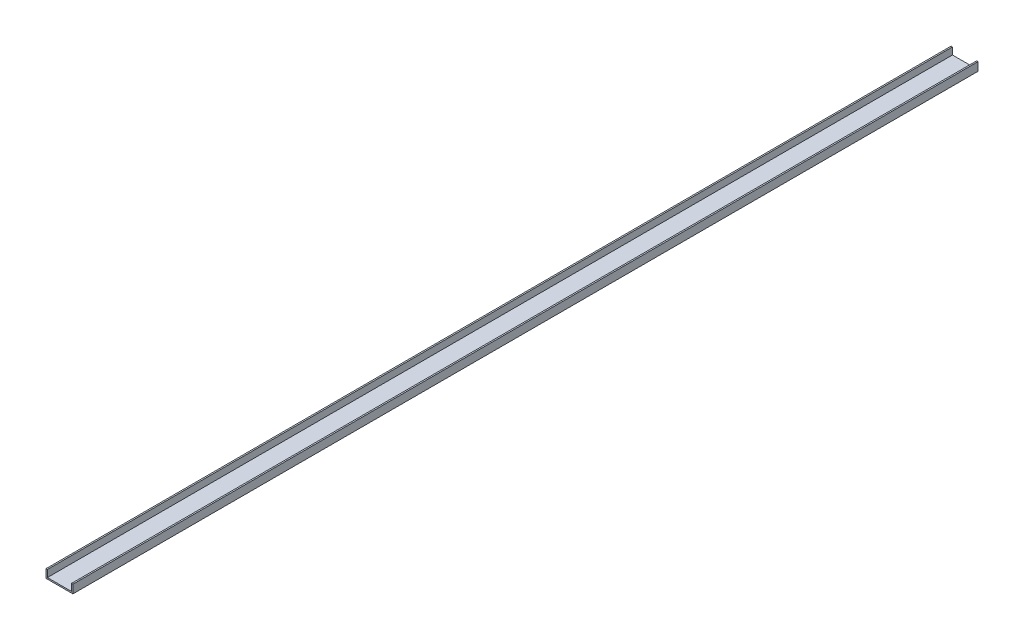
ISO-10303-21;
HEADER;
FILE_DESCRIPTION(('STEP AP214'),'2;1');
FILE_NAME('part.step','',(''),(''),'','','');
FILE_SCHEMA(('AUTOMOTIVE_DESIGN { 1 0 10303 214 1 1 1 1 }'));
ENDSEC;
DATA;
#1=APPLICATION_CONTEXT('core data for automotive mechanical design processes');
#2=APPLICATION_PROTOCOL_DEFINITION('international standard','automotive_design',2000,#1);
#3=PRODUCT_CONTEXT('',#1,'mechanical');
#4=PRODUCT('Part','Part','',(#3));
#5=PRODUCT_RELATED_PRODUCT_CATEGORY('part','',(#4));
#6=PRODUCT_DEFINITION_FORMATION('','',#4);
#7=PRODUCT_DEFINITION_CONTEXT('part definition',#1,'design');
#8=PRODUCT_DEFINITION('design','',#6,#7);
#9=PRODUCT_DEFINITION_SHAPE('','',#8);
#10=(LENGTH_UNIT() NAMED_UNIT(*) SI_UNIT(.MILLI.,.METRE.));
#11=(NAMED_UNIT(*) PLANE_ANGLE_UNIT() SI_UNIT($,.RADIAN.));
#12=(NAMED_UNIT(*) SI_UNIT($,.STERADIAN.) SOLID_ANGLE_UNIT());
#13=UNCERTAINTY_MEASURE_WITH_UNIT(LENGTH_MEASURE(1.E-05),#10,'distance_accuracy_value','');
#14=(GEOMETRIC_REPRESENTATION_CONTEXT(3) GLOBAL_UNCERTAINTY_ASSIGNED_CONTEXT((#13)) GLOBAL_UNIT_ASSIGNED_CONTEXT((#10,
#11,#12)) REPRESENTATION_CONTEXT('',''));
#15=CARTESIAN_POINT('',(0.,0.,0.));
#16=DIRECTION('',(0.,0.,1.));
#17=DIRECTION('',(1.,0.,0.));
#18=AXIS2_PLACEMENT_3D('',#15,#16,#17);
#19=CARTESIAN_POINT('',(-76.2,39.6875,5124.45));
#20=DIRECTION('',(0.,-1.,0.));
#21=DIRECTION('',(0.,0.,-1.));
#22=AXIS2_PLACEMENT_3D('',#19,#20,#21);
#23=PLANE('',#22);
#24=DIRECTION('',(-1.,0.,0.));
#25=VECTOR('',#24,1.);
#26=CARTESIAN_POINT('',(-76.2,39.6875,0.));
#27=LINE('',#26,#25);
#28=CARTESIAN_POINT('',(-68.2625,39.6875,0.));
#29=VERTEX_POINT('',#28);
#30=CARTESIAN_POINT('',(-76.2,39.6875,0.));
#31=VERTEX_POINT('',#30);
#32=EDGE_CURVE('E132',#29,#31,#27,.T.);
#33=ORIENTED_EDGE('',*,*,#32,.T.);
#34=DIRECTION('',(0.,0.,-1.));
#35=VECTOR('',#34,1.);
#36=CARTESIAN_POINT('',(-76.2,39.6875,5124.45));
#37=LINE('',#36,#35);
#38=CARTESIAN_POINT('',(-76.2,39.6875,5124.45));
#39=VERTEX_POINT('',#38);
#40=EDGE_CURVE('E11',#39,#31,#37,.T.);
#41=ORIENTED_EDGE('',*,*,#40,.F.);
#42=DIRECTION('',(-1.,0.,0.));
#43=VECTOR('',#42,1.);
#44=CARTESIAN_POINT('',(-76.2,39.6875,5124.45));
#45=LINE('',#44,#43);
#46=CARTESIAN_POINT('',(-68.2625,39.6875,5124.45));
#47=VERTEX_POINT('',#46);
#48=EDGE_CURVE('E146',#47,#39,#45,.T.);
#49=ORIENTED_EDGE('',*,*,#48,.F.);
#50=DIRECTION('',(0.,0.,-1.));
#51=VECTOR('',#50,1.);
#52=CARTESIAN_POINT('',(-68.2625,39.6875,5124.45));
#53=LINE('',#52,#51);
#54=EDGE_CURVE('E128',#47,#29,#53,.T.);
#55=ORIENTED_EDGE('',*,*,#54,.T.);
#56=EDGE_LOOP('',(#33,#41,#49,#55));
#57=FACE_BOUND('',#56,.T.);
#58=ADVANCED_FACE('F36',(#57),#23,.F.);
#59=CARTESIAN_POINT('',(-76.2,-7.9375,5124.45));
#60=DIRECTION('',(1.,0.,0.));
#61=DIRECTION('',(0.,0.,-1.));
#62=AXIS2_PLACEMENT_3D('',#59,#60,#61);
#63=PLANE('',#62);
#64=DIRECTION('',(0.,-1.,0.));
#65=VECTOR('',#64,1.);
#66=CARTESIAN_POINT('',(-76.2,-7.9375,0.));
#67=LINE('',#66,#65);
#68=CARTESIAN_POINT('',(-76.2,-7.9375,0.));
#69=VERTEX_POINT('',#68);
#70=EDGE_CURVE('E135',#31,#69,#67,.T.);
#71=ORIENTED_EDGE('',*,*,#70,.T.);
#72=DIRECTION('',(0.,0.,-1.));
#73=VECTOR('',#72,1.);
#74=CARTESIAN_POINT('',(-76.2,-7.9375,5124.45));
#75=LINE('',#74,#73);
#76=CARTESIAN_POINT('',(-76.2,-7.9375,5124.45));
#77=VERTEX_POINT('',#76);
#78=EDGE_CURVE('E44',#77,#69,#75,.T.);
#79=ORIENTED_EDGE('',*,*,#78,.F.);
#80=DIRECTION('',(0.,-1.,0.));
#81=VECTOR('',#80,1.);
#82=CARTESIAN_POINT('',(-76.2,-7.9375,5124.45));
#83=LINE('',#82,#81);
#84=EDGE_CURVE('E95',#39,#77,#83,.T.);
#85=ORIENTED_EDGE('',*,*,#84,.F.);
#86=ORIENTED_EDGE('',*,*,#40,.T.);
#87=EDGE_LOOP('',(#71,#79,#85,#86));
#88=FACE_BOUND('',#87,.T.);
#89=ADVANCED_FACE('F181',(#88),#63,.F.);
#90=CARTESIAN_POINT('',(-76.2,-7.9375,5124.45));
#91=DIRECTION('',(0.,1.,0.));
#92=DIRECTION('',(0.,0.,1.));
#93=AXIS2_PLACEMENT_3D('',#90,#91,#92);
#94=PLANE('',#93);
#95=DIRECTION('',(1.,0.,0.));
#96=VECTOR('',#95,1.);
#97=CARTESIAN_POINT('',(-76.2,-7.9375,0.));
#98=LINE('',#97,#96);
#99=CARTESIAN_POINT('',(76.2,-7.9375,0.));
#100=VERTEX_POINT('',#99);
#101=EDGE_CURVE('E137',#69,#100,#98,.T.);
#102=ORIENTED_EDGE('',*,*,#101,.T.);
#103=DIRECTION('',(0.,0.,-1.));
#104=VECTOR('',#103,1.);
#105=CARTESIAN_POINT('',(76.2,-7.9375,5124.45));
#106=LINE('',#105,#104);
#107=CARTESIAN_POINT('',(76.2,-7.9375,5124.45));
#108=VERTEX_POINT('',#107);
#109=EDGE_CURVE('E153',#108,#100,#106,.T.);
#110=ORIENTED_EDGE('',*,*,#109,.F.);
#111=DIRECTION('',(1.,0.,0.));
#112=VECTOR('',#111,1.);
#113=CARTESIAN_POINT('',(-76.2,-7.9375,5124.45));
#114=LINE('',#113,#112);
#115=EDGE_CURVE('E161',#77,#108,#114,.T.);
#116=ORIENTED_EDGE('',*,*,#115,.F.);
#117=ORIENTED_EDGE('',*,*,#78,.T.);
#118=EDGE_LOOP('',(#102,#110,#116,#117));
#119=FACE_BOUND('',#118,.T.);
#120=ADVANCED_FACE('F159',(#119),#94,.F.);
#121=CARTESIAN_POINT('',(76.2,-7.9375,5124.45));
#122=DIRECTION('',(-1.,0.,0.));
#123=DIRECTION('',(0.,0.,1.));
#124=AXIS2_PLACEMENT_3D('',#121,#122,#123);
#125=PLANE('',#124);
#126=DIRECTION('',(0.,1.,0.));
#127=VECTOR('',#126,1.);
#128=CARTESIAN_POINT('',(76.2,-7.9375,0.));
#129=LINE('',#128,#127);
#130=CARTESIAN_POINT('',(76.2,39.6875,0.));
#131=VERTEX_POINT('',#130);
#132=EDGE_CURVE('E139',#100,#131,#129,.T.);
#133=ORIENTED_EDGE('',*,*,#132,.T.);
#134=DIRECTION('',(0.,0.,-1.));
#135=VECTOR('',#134,1.);
#136=CARTESIAN_POINT('',(76.2,39.6875,5124.45));
#137=LINE('',#136,#135);
#138=CARTESIAN_POINT('',(76.2,39.6875,5124.45));
#139=VERTEX_POINT('',#138);
#140=EDGE_CURVE('E150',#139,#131,#137,.T.);
#141=ORIENTED_EDGE('',*,*,#140,.F.);
#142=DIRECTION('',(0.,1.,0.));
#143=VECTOR('',#142,1.);
#144=CARTESIAN_POINT('',(76.2,-7.9375,5124.45));
#145=LINE('',#144,#143);
#146=EDGE_CURVE('E173',#108,#139,#145,.T.);
#147=ORIENTED_EDGE('',*,*,#146,.F.);
#148=ORIENTED_EDGE('',*,*,#109,.T.);
#149=EDGE_LOOP('',(#133,#141,#147,#148));
#150=FACE_BOUND('',#149,.T.);
#151=ADVANCED_FACE('F169',(#150),#125,.F.);
#152=CARTESIAN_POINT('',(76.2,39.6875,5124.45));
#153=DIRECTION('',(0.,-1.,0.));
#154=DIRECTION('',(0.,0.,-1.));
#155=AXIS2_PLACEMENT_3D('',#152,#153,#154);
#156=PLANE('',#155);
#157=DIRECTION('',(-1.,0.,0.));
#158=VECTOR('',#157,1.);
#159=CARTESIAN_POINT('',(76.2,39.6875,0.));
#160=LINE('',#159,#158);
#161=CARTESIAN_POINT('',(68.2625,39.6875,0.));
#162=VERTEX_POINT('',#161);
#163=EDGE_CURVE('E141',#131,#162,#160,.T.);
#164=ORIENTED_EDGE('',*,*,#163,.T.);
#165=DIRECTION('',(0.,0.,-1.));
#166=VECTOR('',#165,1.);
#167=CARTESIAN_POINT('',(68.2625,39.6875,5124.45));
#168=LINE('',#167,#166);
#169=CARTESIAN_POINT('',(68.2625,39.6875,5124.45));
#170=VERTEX_POINT('',#169);
#171=EDGE_CURVE('E123',#170,#162,#168,.T.);
#172=ORIENTED_EDGE('',*,*,#171,.F.);
#173=DIRECTION('',(-1.,0.,0.));
#174=VECTOR('',#173,1.);
#175=CARTESIAN_POINT('',(76.2,39.6875,5124.45));
#176=LINE('',#175,#174);
#177=EDGE_CURVE('E114',#139,#170,#176,.T.);
#178=ORIENTED_EDGE('',*,*,#177,.F.);
#179=ORIENTED_EDGE('',*,*,#140,.T.);
#180=EDGE_LOOP('',(#164,#172,#178,#179));
#181=FACE_BOUND('',#180,.T.);
#182=ADVANCED_FACE('F172',(#181),#156,.F.);
#183=CARTESIAN_POINT('',(68.2625,39.6875,5124.45));
#184=DIRECTION('',(1.,0.,0.));
#185=DIRECTION('',(0.,1.,0.));
#186=AXIS2_PLACEMENT_3D('',#183,#184,#185);
#187=PLANE('',#186);
#188=DIRECTION('',(0.,-1.,0.));
#189=VECTOR('',#188,1.);
#190=CARTESIAN_POINT('',(68.2625,39.6875,0.));
#191=LINE('',#190,#189);
#192=CARTESIAN_POINT('',(68.2625,0.,0.));
#193=VERTEX_POINT('',#192);
#194=EDGE_CURVE('E122',#162,#193,#191,.T.);
#195=ORIENTED_EDGE('',*,*,#194,.T.);
#196=DIRECTION('',(0.,0.,-1.));
#197=VECTOR('',#196,1.);
#198=CARTESIAN_POINT('',(68.2625,0.,5124.45));
#199=LINE('',#198,#197);
#200=CARTESIAN_POINT('',(68.2625,0.,5124.45));
#201=VERTEX_POINT('',#200);
#202=EDGE_CURVE('E119',#201,#193,#199,.T.);
#203=ORIENTED_EDGE('',*,*,#202,.F.);
#204=DIRECTION('',(0.,-1.,0.));
#205=VECTOR('',#204,1.);
#206=CARTESIAN_POINT('',(68.2625,39.6875,5124.45));
#207=LINE('',#206,#205);
#208=EDGE_CURVE('E108',#170,#201,#207,.T.);
#209=ORIENTED_EDGE('',*,*,#208,.F.);
#210=ORIENTED_EDGE('',*,*,#171,.T.);
#211=EDGE_LOOP('',(#195,#203,#209,#210));
#212=FACE_BOUND('',#211,.T.);
#213=ADVANCED_FACE('F120',(#212),#187,.F.);
#214=CARTESIAN_POINT('',(-68.2625,0.,5124.45));
#215=DIRECTION('',(0.,-1.,0.));
#216=DIRECTION('',(0.,0.,-1.));
#217=AXIS2_PLACEMENT_3D('',#214,#215,#216);
#218=PLANE('',#217);
#219=DIRECTION('',(-1.,0.,0.));
#220=VECTOR('',#219,1.);
#221=CARTESIAN_POINT('',(-68.2625,0.,0.));
#222=LINE('',#221,#220);
#223=CARTESIAN_POINT('',(-68.2625,0.,0.));
#224=VERTEX_POINT('',#223);
#225=EDGE_CURVE('E81',#193,#224,#222,.T.);
#226=ORIENTED_EDGE('',*,*,#225,.T.);
#227=DIRECTION('',(0.,0.,-1.));
#228=VECTOR('',#227,1.);
#229=CARTESIAN_POINT('',(-68.2625,0.,5124.45));
#230=LINE('',#229,#228);
#231=CARTESIAN_POINT('',(-68.2625,0.,5124.45));
#232=VERTEX_POINT('',#231);
#233=EDGE_CURVE('E124',#232,#224,#230,.T.);
#234=ORIENTED_EDGE('',*,*,#233,.F.);
#235=DIRECTION('',(-1.,0.,0.));
#236=VECTOR('',#235,1.);
#237=CARTESIAN_POINT('',(-68.2625,0.,5124.45));
#238=LINE('',#237,#236);
#239=EDGE_CURVE('E112',#201,#232,#238,.T.);
#240=ORIENTED_EDGE('',*,*,#239,.F.);
#241=ORIENTED_EDGE('',*,*,#202,.T.);
#242=EDGE_LOOP('',(#226,#234,#240,#241));
#243=FACE_BOUND('',#242,.T.);
#244=ADVANCED_FACE('F126',(#243),#218,.F.);
#245=CARTESIAN_POINT('',(-68.2625,39.6875,5124.45));
#246=DIRECTION('',(-1.,0.,0.));
#247=DIRECTION('',(0.,-1.,0.));
#248=AXIS2_PLACEMENT_3D('',#245,#246,#247);
#249=PLANE('',#248);
#250=DIRECTION('',(0.,1.,0.));
#251=VECTOR('',#250,1.);
#252=CARTESIAN_POINT('',(-68.2625,39.6875,0.));
#253=LINE('',#252,#251);
#254=EDGE_CURVE('E87',#224,#29,#253,.T.);
#255=ORIENTED_EDGE('',*,*,#254,.T.);
#256=ORIENTED_EDGE('',*,*,#54,.F.);
#257=DIRECTION('',(0.,1.,0.));
#258=VECTOR('',#257,1.);
#259=CARTESIAN_POINT('',(-68.2625,39.6875,5124.45));
#260=LINE('',#259,#258);
#261=EDGE_CURVE('E52',#232,#47,#260,.T.);
#262=ORIENTED_EDGE('',*,*,#261,.F.);
#263=ORIENTED_EDGE('',*,*,#233,.T.);
#264=EDGE_LOOP('',(#255,#256,#262,#263));
#265=FACE_BOUND('',#264,.T.);
#266=ADVANCED_FACE('F197',(#265),#249,.F.);
#267=CARTESIAN_POINT('',(0.,0.,5124.45));
#268=DIRECTION('',(0.,0.,-1.));
#269=DIRECTION('',(-1.,0.,0.));
#270=AXIS2_PLACEMENT_3D('',#267,#268,#269);
#271=PLANE('',#270);
#272=ORIENTED_EDGE('',*,*,#48,.T.);
#273=ORIENTED_EDGE('',*,*,#84,.T.);
#274=ORIENTED_EDGE('',*,*,#115,.T.);
#275=ORIENTED_EDGE('',*,*,#146,.T.);
#276=ORIENTED_EDGE('',*,*,#177,.T.);
#277=ORIENTED_EDGE('',*,*,#208,.T.);
#278=ORIENTED_EDGE('',*,*,#239,.T.);
#279=ORIENTED_EDGE('',*,*,#261,.T.);
#280=EDGE_LOOP('',(#272,#273,#274,#275,#276,#277,#278,#279));
#281=FACE_BOUND('',#280,.T.);
#282=ADVANCED_FACE('F110',(#281),#271,.F.);
#283=CARTESIAN_POINT('',(0.,0.,0.));
#284=DIRECTION('',(0.,0.,-1.));
#285=DIRECTION('',(-1.,0.,0.));
#286=AXIS2_PLACEMENT_3D('',#283,#284,#285);
#287=PLANE('',#286);
#288=ORIENTED_EDGE('',*,*,#32,.F.);
#289=ORIENTED_EDGE('',*,*,#254,.F.);
#290=ORIENTED_EDGE('',*,*,#225,.F.);
#291=ORIENTED_EDGE('',*,*,#194,.F.);
#292=ORIENTED_EDGE('',*,*,#163,.F.);
#293=ORIENTED_EDGE('',*,*,#132,.F.);
#294=ORIENTED_EDGE('',*,*,#101,.F.);
#295=ORIENTED_EDGE('',*,*,#70,.F.);
#296=EDGE_LOOP('',(#288,#289,#290,#291,#292,#293,#294,#295));
#297=FACE_BOUND('',#296,.T.);
#298=ADVANCED_FACE('F165',(#297),#287,.T.);
#299=CLOSED_SHELL('',(#58,#89,#120,#151,#182,#213,#244,#266,#282,#298));
#300=MANIFOLD_SOLID_BREP('B2',#299);
#301=ADVANCED_BREP_SHAPE_REPRESENTATION('',(#18,#300),#14);
#302=SHAPE_DEFINITION_REPRESENTATION(#9,#301);
ENDSEC;
END-ISO-10303-21;
